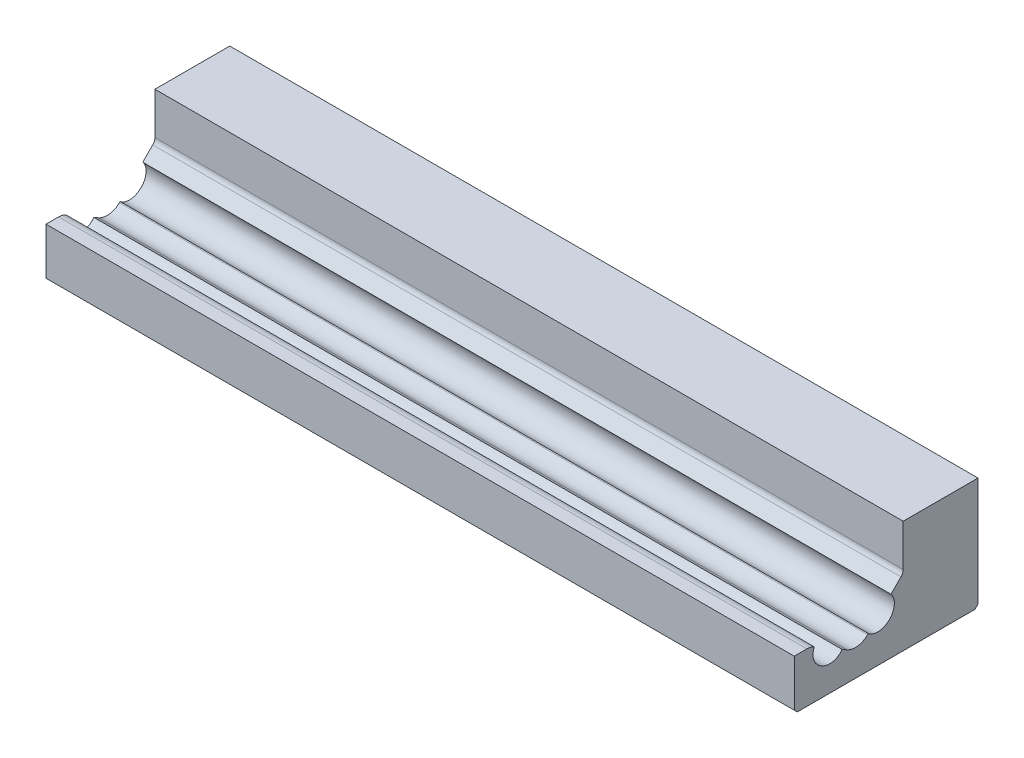
ISO-10303-21;
HEADER;
FILE_DESCRIPTION(('STEP AP214'),'2;1');
FILE_NAME('part.step','',(''),(''),'','','');
FILE_SCHEMA(('AUTOMOTIVE_DESIGN { 1 0 10303 214 1 1 1 1 }'));
ENDSEC;
DATA;
#1=APPLICATION_CONTEXT('core data for automotive mechanical design processes');
#2=APPLICATION_PROTOCOL_DEFINITION('international standard','automotive_design',2000,#1);
#3=PRODUCT_CONTEXT('',#1,'mechanical');
#4=PRODUCT('Part','Part','',(#3));
#5=PRODUCT_RELATED_PRODUCT_CATEGORY('part','',(#4));
#6=PRODUCT_DEFINITION_FORMATION('','',#4);
#7=PRODUCT_DEFINITION_CONTEXT('part definition',#1,'design');
#8=PRODUCT_DEFINITION('design','',#6,#7);
#9=PRODUCT_DEFINITION_SHAPE('','',#8);
#10=(LENGTH_UNIT() NAMED_UNIT(*) SI_UNIT(.MILLI.,.METRE.));
#11=(NAMED_UNIT(*) PLANE_ANGLE_UNIT() SI_UNIT($,.RADIAN.));
#12=(NAMED_UNIT(*) SI_UNIT($,.STERADIAN.) SOLID_ANGLE_UNIT());
#13=UNCERTAINTY_MEASURE_WITH_UNIT(LENGTH_MEASURE(1.E-05),#10,'distance_accuracy_value','');
#14=(GEOMETRIC_REPRESENTATION_CONTEXT(3) GLOBAL_UNCERTAINTY_ASSIGNED_CONTEXT((#13)) GLOBAL_UNIT_ASSIGNED_CONTEXT((#10,
#11,#12)) REPRESENTATION_CONTEXT('',''));
#15=CARTESIAN_POINT('',(0.,0.,0.));
#16=DIRECTION('',(0.,0.,1.));
#17=DIRECTION('',(1.,0.,0.));
#18=AXIS2_PLACEMENT_3D('',#15,#16,#17);
#19=CARTESIAN_POINT('',(100.,1.99999999999996,1.99999999999995));
#20=DIRECTION('',(0.,0.70710678118655,0.707106781186545));
#21=DIRECTION('',(0.,-0.707106781186545,0.70710678118655));
#22=AXIS2_PLACEMENT_3D('',#19,#20,#21);
#23=PLANE('',#22);
#24=DIRECTION('',(0.,0.707106781186545,-0.70710678118655));
#25=VECTOR('',#24,1.);
#26=CARTESIAN_POINT('',(0.,1.99999999999996,1.99999999999995));
#27=LINE('',#26,#25);
#28=CARTESIAN_POINT('',(0.,-10.7520611318491,14.7520611318491));
#29=VERTEX_POINT('',#28);
#30=CARTESIAN_POINT('',(0.,-10.662444372845,14.6624443728451));
#31=VERTEX_POINT('',#30);
#32=EDGE_CURVE('E183',#29,#31,#27,.T.);
#33=ORIENTED_EDGE('',*,*,#32,.F.);
#34=DIRECTION('',(-1.,0.,0.));
#35=VECTOR('',#34,1.);
#36=CARTESIAN_POINT('',(100.,-10.7520611318491,14.7520611318491));
#37=LINE('',#36,#35);
#38=CARTESIAN_POINT('',(100.,-10.7520611318491,14.7520611318491));
#39=VERTEX_POINT('',#38);
#40=EDGE_CURVE('E11',#39,#29,#37,.T.);
#41=ORIENTED_EDGE('',*,*,#40,.F.);
#42=DIRECTION('',(0.,0.707106781186545,-0.70710678118655));
#43=VECTOR('',#42,1.);
#44=CARTESIAN_POINT('',(100.,1.99999999999996,1.99999999999995));
#45=LINE('',#44,#43);
#46=CARTESIAN_POINT('',(100.,-10.662444372845,14.6624443728451));
#47=VERTEX_POINT('',#46);
#48=EDGE_CURVE('E343',#39,#47,#45,.T.);
#49=ORIENTED_EDGE('',*,*,#48,.T.);
#50=DIRECTION('',(-1.,0.,0.));
#51=VECTOR('',#50,1.);
#52=CARTESIAN_POINT('',(100.,-10.662444372845,14.6624443728451));
#53=LINE('',#52,#51);
#54=EDGE_CURVE('E57',#47,#31,#53,.T.);
#55=ORIENTED_EDGE('',*,*,#54,.T.);
#56=EDGE_LOOP('',(#33,#41,#49,#55));
#57=FACE_BOUND('',#56,.T.);
#58=ADVANCED_FACE('F41',(#57),#23,.T.);
#59=CARTESIAN_POINT('',(100.,-9.12571553511999,16.3784067285781));
#60=DIRECTION('',(-1.,0.,0.));
#61=DIRECTION('',(0.,0.,1.));
#62=AXIS2_PLACEMENT_3D('',#59,#60,#61);
#63=CYLINDRICAL_SURFACE('',#62,2.29999999999999);
#64=CARTESIAN_POINT('',(0.,-9.12571553511999,16.3784067285781));
#65=DIRECTION('',(1.,0.,0.));
#66=DIRECTION('',(0.,0.,-1.));
#67=AXIS2_PLACEMENT_3D('',#64,#65,#66);
#68=CIRCLE('',#67,2.29999999999999);
#69=CARTESIAN_POINT('',(0.,-11.117573963824,17.5284067285782));
#70=VERTEX_POINT('',#69);
#71=EDGE_CURVE('E307',#70,#29,#68,.T.);
#72=ORIENTED_EDGE('',*,*,#71,.F.);
#73=DIRECTION('',(-1.,0.,0.));
#74=VECTOR('',#73,1.);
#75=CARTESIAN_POINT('',(100.,-11.117573963824,17.5284067285782));
#76=LINE('',#75,#74);
#77=CARTESIAN_POINT('',(100.,-11.117573963824,17.5284067285782));
#78=VERTEX_POINT('',#77);
#79=EDGE_CURVE('E49',#78,#70,#76,.T.);
#80=ORIENTED_EDGE('',*,*,#79,.F.);
#81=CARTESIAN_POINT('',(100.,-9.12571553511999,16.3784067285781));
#82=DIRECTION('',(1.,0.,0.));
#83=DIRECTION('',(0.,0.,-1.));
#84=AXIS2_PLACEMENT_3D('',#81,#82,#83);
#85=CIRCLE('',#84,2.29999999999999);
#86=EDGE_CURVE('E344',#78,#39,#85,.T.);
#87=ORIENTED_EDGE('',*,*,#86,.T.);
#88=ORIENTED_EDGE('',*,*,#40,.T.);
#89=EDGE_LOOP('',(#72,#80,#87,#88));
#90=FACE_BOUND('',#89,.T.);
#91=ADVANCED_FACE('F312',(#90),#63,.F.);
#92=CARTESIAN_POINT('',(100.,-15.9282032302754,9.19615242270787));
#93=DIRECTION('',(0.,-0.866025403784408,0.500000000000054));
#94=DIRECTION('',(0.,-0.500000000000054,-0.866025403784408));
#95=AXIS2_PLACEMENT_3D('',#92,#93,#94);
#96=PLANE('',#95);
#97=DIRECTION('',(0.,0.500000000000054,0.866025403784408));
#98=VECTOR('',#97,1.);
#99=CARTESIAN_POINT('',(0.,-15.9282032302754,9.19615242270787));
#100=LINE('',#99,#98);
#101=CARTESIAN_POINT('',(0.,-10.7525450203595,18.1606554048919));
#102=VERTEX_POINT('',#101);
#103=EDGE_CURVE('E299',#70,#102,#100,.T.);
#104=ORIENTED_EDGE('',*,*,#103,.T.);
#105=DIRECTION('',(-1.,0.,0.));
#106=VECTOR('',#105,1.);
#107=CARTESIAN_POINT('',(100.,-10.7525450203595,18.1606554048919));
#108=LINE('',#107,#106);
#109=CARTESIAN_POINT('',(100.,-10.7525450203595,18.1606554048919));
#110=VERTEX_POINT('',#109);
#111=EDGE_CURVE('E292',#110,#102,#108,.T.);
#112=ORIENTED_EDGE('',*,*,#111,.F.);
#113=DIRECTION('',(0.,0.500000000000054,0.866025403784408));
#114=VECTOR('',#113,1.);
#115=CARTESIAN_POINT('',(100.,-15.9282032302754,9.19615242270787));
#116=LINE('',#115,#114);
#117=EDGE_CURVE('E243',#78,#110,#116,.T.);
#118=ORIENTED_EDGE('',*,*,#117,.F.);
#119=ORIENTED_EDGE('',*,*,#79,.T.);
#120=EDGE_LOOP('',(#104,#112,#118,#119));
#121=FACE_BOUND('',#120,.T.);
#122=ADVANCED_FACE('F236',(#121),#96,.F.);
#123=CARTESIAN_POINT('',(100.,-9.55066891100103,19.9423658907042));
#124=DIRECTION('',(1.,0.,0.));
#125=DIRECTION('',(0.,-0.500000000000003,-0.866025403784437));
#126=AXIS2_PLACEMENT_3D('',#123,#124,#125);
#127=ELLIPSE('',#126,2.15,2.);
#128=DIRECTION('',(-1.,0.,0.));
#129=VECTOR('',#128,1.);
#130=SURFACE_OF_LINEAR_EXTRUSION('',#127,#129);
#131=ORIENTED_EDGE('',*,*,#111,.T.);
#132=CARTESIAN_POINT('',(0.,-9.55066891100103,19.9423658907042));
#133=DIRECTION('',(1.,0.,0.));
#134=DIRECTION('',(0.,-0.500000000000003,-0.866025403784437));
#135=AXIS2_PLACEMENT_3D('',#132,#133,#134);
#136=ELLIPSE('',#135,2.15,2.);
#137=CARTESIAN_POINT('',(0.,-8.60860042277792,21.8740763765164));
#138=VERTEX_POINT('',#137);
#139=EDGE_CURVE('E310',#138,#102,#136,.T.);
#140=ORIENTED_EDGE('',*,*,#139,.F.);
#141=DIRECTION('',(-1.,0.,0.));
#142=VECTOR('',#141,1.);
#143=CARTESIAN_POINT('',(100.,-8.60860042277792,21.8740763765164));
#144=LINE('',#143,#142);
#145=CARTESIAN_POINT('',(100.,-8.60860042277792,21.8740763765164));
#146=VERTEX_POINT('',#145);
#147=EDGE_CURVE('E290',#146,#138,#144,.T.);
#148=ORIENTED_EDGE('',*,*,#147,.F.);
#149=EDGE_CURVE('E238',#146,#110,#127,.T.);
#150=ORIENTED_EDGE('',*,*,#149,.T.);
#151=EDGE_LOOP('',(#131,#140,#148,#150));
#152=FACE_BOUND('',#151,.T.);
#153=ADVANCED_FACE('F231',(#152),#130,.T.);
#154=CARTESIAN_POINT('',(100.,-10.3406512303467,22.8740763765164));
#155=DIRECTION('',(-1.,0.,0.));
#156=DIRECTION('',(0.,0.,1.));
#157=AXIS2_PLACEMENT_3D('',#154,#155,#156);
#158=CYLINDRICAL_SURFACE('',#157,1.99999999999988);
#159=CARTESIAN_POINT('',(0.,-10.3406512303467,22.8740763765164));
#160=DIRECTION('',(1.,0.,0.));
#161=DIRECTION('',(0.,0.,-1.));
#162=AXIS2_PLACEMENT_3D('',#159,#160,#161);
#163=CIRCLE('',#162,1.99999999999988);
#164=CARTESIAN_POINT('',(0.,-8.34065123034669,22.8740763765164));
#165=VERTEX_POINT('',#164);
#166=EDGE_CURVE('E315',#138,#165,#163,.T.);
#167=ORIENTED_EDGE('',*,*,#166,.T.);
#168=DIRECTION('',(-1.,0.,0.));
#169=VECTOR('',#168,1.);
#170=CARTESIAN_POINT('',(100.,-8.34065123034669,22.8740763765164));
#171=LINE('',#170,#169);
#172=CARTESIAN_POINT('',(100.,-8.34065123034669,22.8740763765164));
#173=VERTEX_POINT('',#172);
#174=EDGE_CURVE('E287',#173,#165,#171,.T.);
#175=ORIENTED_EDGE('',*,*,#174,.F.);
#176=CARTESIAN_POINT('',(100.,-10.3406512303467,22.8740763765164));
#177=DIRECTION('',(1.,0.,0.));
#178=DIRECTION('',(0.,0.,-1.));
#179=AXIS2_PLACEMENT_3D('',#176,#177,#178);
#180=CIRCLE('',#179,1.99999999999988);
#181=EDGE_CURVE('E242',#146,#173,#180,.T.);
#182=ORIENTED_EDGE('',*,*,#181,.F.);
#183=ORIENTED_EDGE('',*,*,#147,.T.);
#184=EDGE_LOOP('',(#167,#175,#182,#183));
#185=FACE_BOUND('',#184,.T.);
#186=ADVANCED_FACE('F227',(#185),#158,.T.);
#187=CARTESIAN_POINT('',(100.,-8.34065123034673,0.));
#188=DIRECTION('',(0.,-1.,0.));
#189=DIRECTION('',(0.,0.,-1.));
#190=AXIS2_PLACEMENT_3D('',#187,#188,#189);
#191=PLANE('',#190);
#192=DIRECTION('',(0.,0.,1.));
#193=VECTOR('',#192,1.);
#194=CARTESIAN_POINT('',(0.,-8.34065123034673,0.));
#195=LINE('',#194,#193);
#196=CARTESIAN_POINT('',(0.,-8.34065123034669,24.5558641755391));
#197=VERTEX_POINT('',#196);
#198=EDGE_CURVE('E317',#165,#197,#195,.T.);
#199=ORIENTED_EDGE('',*,*,#198,.T.);
#200=DIRECTION('',(-1.,0.,0.));
#201=VECTOR('',#200,1.);
#202=CARTESIAN_POINT('',(100.,-8.34065123034669,24.5558641755391));
#203=LINE('',#202,#201);
#204=CARTESIAN_POINT('',(100.,-8.34065123034669,24.5558641755391));
#205=VERTEX_POINT('',#204);
#206=EDGE_CURVE('E285',#205,#197,#203,.T.);
#207=ORIENTED_EDGE('',*,*,#206,.F.);
#208=DIRECTION('',(0.,0.,1.));
#209=VECTOR('',#208,1.);
#210=CARTESIAN_POINT('',(100.,-8.34065123034673,0.));
#211=LINE('',#210,#209);
#212=EDGE_CURVE('E246',#173,#205,#211,.T.);
#213=ORIENTED_EDGE('',*,*,#212,.F.);
#214=ORIENTED_EDGE('',*,*,#174,.T.);
#215=EDGE_LOOP('',(#199,#207,#213,#214));
#216=FACE_BOUND('',#215,.T.);
#217=ADVANCED_FACE('F223',(#216),#191,.F.);
#218=CARTESIAN_POINT('',(100.,0.,24.5558641755391));
#219=DIRECTION('',(0.,0.,1.));
#220=DIRECTION('',(1.,0.,0.));
#221=AXIS2_PLACEMENT_3D('',#218,#219,#220);
#222=PLANE('',#221);
#223=DIRECTION('',(0.,1.,0.));
#224=VECTOR('',#223,1.);
#225=CARTESIAN_POINT('',(0.,0.,24.5558641755391));
#226=LINE('',#225,#224);
#227=CARTESIAN_POINT('',(0.,-14.6,24.5558641755391));
#228=VERTEX_POINT('',#227);
#229=EDGE_CURVE('E320',#228,#197,#226,.T.);
#230=ORIENTED_EDGE('',*,*,#229,.F.);
#231=DIRECTION('',(-1.,0.,0.));
#232=VECTOR('',#231,1.);
#233=CARTESIAN_POINT('',(100.,-14.6,24.5558641755391));
#234=LINE('',#233,#232);
#235=CARTESIAN_POINT('',(100.,-14.6,24.5558641755391));
#236=VERTEX_POINT('',#235);
#237=EDGE_CURVE('E283',#236,#228,#234,.T.);
#238=ORIENTED_EDGE('',*,*,#237,.F.);
#239=DIRECTION('',(0.,1.,0.));
#240=VECTOR('',#239,1.);
#241=CARTESIAN_POINT('',(100.,0.,24.5558641755391));
#242=LINE('',#241,#240);
#243=EDGE_CURVE('E248',#236,#205,#242,.T.);
#244=ORIENTED_EDGE('',*,*,#243,.T.);
#245=ORIENTED_EDGE('',*,*,#206,.T.);
#246=EDGE_LOOP('',(#230,#238,#244,#245));
#247=FACE_BOUND('',#246,.T.);
#248=ADVANCED_FACE('F219',(#247),#222,.T.);
#249=CARTESIAN_POINT('',(100.,-19.5779320877695,19.5779320877695));
#250=DIRECTION('',(0.,0.707106781186548,-0.707106781186548));
#251=DIRECTION('',(0.,0.707106781186548,0.707106781186548));
#252=AXIS2_PLACEMENT_3D('',#249,#250,#251);
#253=PLANE('',#252);
#254=DIRECTION('',(0.,-0.707106781186548,-0.707106781186548));
#255=VECTOR('',#254,1.);
#256=CARTESIAN_POINT('',(0.,-19.5779320877695,19.5779320877695));
#257=LINE('',#256,#255);
#258=CARTESIAN_POINT('',(0.,-15.,24.1558641755391));
#259=VERTEX_POINT('',#258);
#260=EDGE_CURVE('E323',#228,#259,#257,.T.);
#261=ORIENTED_EDGE('',*,*,#260,.T.);
#262=DIRECTION('',(-1.,0.,0.));
#263=VECTOR('',#262,1.);
#264=CARTESIAN_POINT('',(100.,-15.,24.1558641755391));
#265=LINE('',#264,#263);
#266=CARTESIAN_POINT('',(100.,-15.,24.1558641755391));
#267=VERTEX_POINT('',#266);
#268=EDGE_CURVE('E281',#267,#259,#265,.T.);
#269=ORIENTED_EDGE('',*,*,#268,.F.);
#270=DIRECTION('',(0.,-0.707106781186548,-0.707106781186548));
#271=VECTOR('',#270,1.);
#272=CARTESIAN_POINT('',(100.,-19.5779320877695,19.5779320877695));
#273=LINE('',#272,#271);
#274=EDGE_CURVE('E251',#236,#267,#273,.T.);
#275=ORIENTED_EDGE('',*,*,#274,.F.);
#276=ORIENTED_EDGE('',*,*,#237,.T.);
#277=EDGE_LOOP('',(#261,#269,#275,#276));
#278=FACE_BOUND('',#277,.T.);
#279=ADVANCED_FACE('F215',(#278),#253,.F.);
#280=CARTESIAN_POINT('',(100.,-15.,0.));
#281=DIRECTION('',(0.,-1.,0.));
#282=DIRECTION('',(0.,0.,-1.));
#283=AXIS2_PLACEMENT_3D('',#280,#281,#282);
#284=PLANE('',#283);
#285=DIRECTION('',(0.,0.,1.));
#286=VECTOR('',#285,1.);
#287=CARTESIAN_POINT('',(0.,-15.,0.));
#288=LINE('',#287,#286);
#289=CARTESIAN_POINT('',(0.,-15.,0.399999999999998));
#290=VERTEX_POINT('',#289);
#291=EDGE_CURVE('E326',#290,#259,#288,.T.);
#292=ORIENTED_EDGE('',*,*,#291,.F.);
#293=DIRECTION('',(-1.,0.,0.));
#294=VECTOR('',#293,1.);
#295=CARTESIAN_POINT('',(100.,-15.,0.399999999999998));
#296=LINE('',#295,#294);
#297=CARTESIAN_POINT('',(100.,-15.,0.399999999999998));
#298=VERTEX_POINT('',#297);
#299=EDGE_CURVE('E279',#298,#290,#296,.T.);
#300=ORIENTED_EDGE('',*,*,#299,.F.);
#301=DIRECTION('',(0.,0.,1.));
#302=VECTOR('',#301,1.);
#303=CARTESIAN_POINT('',(100.,-15.,0.));
#304=LINE('',#303,#302);
#305=EDGE_CURVE('E253',#298,#267,#304,.T.);
#306=ORIENTED_EDGE('',*,*,#305,.T.);
#307=ORIENTED_EDGE('',*,*,#268,.T.);
#308=EDGE_LOOP('',(#292,#300,#306,#307));
#309=FACE_BOUND('',#308,.T.);
#310=ADVANCED_FACE('F211',(#309),#284,.T.);
#311=CARTESIAN_POINT('',(100.,-7.30000000000008,-7.3));
#312=DIRECTION('',(0.,0.707106781186551,0.707106781186544));
#313=DIRECTION('',(0.,-0.707106781186544,0.707106781186551));
#314=AXIS2_PLACEMENT_3D('',#311,#312,#313);
#315=PLANE('',#314);
#316=DIRECTION('',(0.,0.707106781186544,-0.707106781186551));
#317=VECTOR('',#316,1.);
#318=CARTESIAN_POINT('',(0.,-7.30000000000008,-7.3));
#319=LINE('',#318,#317);
#320=CARTESIAN_POINT('',(0.,-14.6,0.));
#321=VERTEX_POINT('',#320);
#322=EDGE_CURVE('E329',#290,#321,#319,.T.);
#323=ORIENTED_EDGE('',*,*,#322,.T.);
#324=DIRECTION('',(-1.,0.,0.));
#325=VECTOR('',#324,1.);
#326=CARTESIAN_POINT('',(100.,-14.6,0.));
#327=LINE('',#326,#325);
#328=CARTESIAN_POINT('',(100.,-14.6,0.));
#329=VERTEX_POINT('',#328);
#330=EDGE_CURVE('E277',#329,#321,#327,.T.);
#331=ORIENTED_EDGE('',*,*,#330,.F.);
#332=DIRECTION('',(0.,0.707106781186544,-0.707106781186551));
#333=VECTOR('',#332,1.);
#334=CARTESIAN_POINT('',(100.,-7.30000000000008,-7.3));
#335=LINE('',#334,#333);
#336=EDGE_CURVE('E256',#298,#329,#335,.T.);
#337=ORIENTED_EDGE('',*,*,#336,.F.);
#338=ORIENTED_EDGE('',*,*,#299,.T.);
#339=EDGE_LOOP('',(#323,#331,#337,#338));
#340=FACE_BOUND('',#339,.T.);
#341=ADVANCED_FACE('F207',(#340),#315,.F.);
#342=CARTESIAN_POINT('',(100.,0.,0.));
#343=DIRECTION('',(0.,0.,-1.));
#344=DIRECTION('',(-1.,0.,0.));
#345=AXIS2_PLACEMENT_3D('',#342,#343,#344);
#346=PLANE('',#345);
#347=DIRECTION('',(0.,-1.,0.));
#348=VECTOR('',#347,1.);
#349=CARTESIAN_POINT('',(0.,0.,0.));
#350=LINE('',#349,#348);
#351=CARTESIAN_POINT('',(0.,0.,0.));
#352=VERTEX_POINT('',#351);
#353=EDGE_CURVE('E332',#352,#321,#350,.T.);
#354=ORIENTED_EDGE('',*,*,#353,.F.);
#355=DIRECTION('',(-1.,0.,0.));
#356=VECTOR('',#355,1.);
#357=CARTESIAN_POINT('',(100.,0.,0.));
#358=LINE('',#357,#356);
#359=CARTESIAN_POINT('',(100.,0.,0.));
#360=VERTEX_POINT('',#359);
#361=EDGE_CURVE('E270',#360,#352,#358,.T.);
#362=ORIENTED_EDGE('',*,*,#361,.F.);
#363=DIRECTION('',(0.,-1.,0.));
#364=VECTOR('',#363,1.);
#365=CARTESIAN_POINT('',(100.,0.,0.));
#366=LINE('',#365,#364);
#367=EDGE_CURVE('E258',#360,#329,#366,.T.);
#368=ORIENTED_EDGE('',*,*,#367,.T.);
#369=ORIENTED_EDGE('',*,*,#330,.T.);
#370=EDGE_LOOP('',(#354,#362,#368,#369));
#371=FACE_BOUND('',#370,.T.);
#372=ADVANCED_FACE('F203',(#371),#346,.T.);
#373=CARTESIAN_POINT('',(100.,0.,0.));
#374=DIRECTION('',(0.,-1.,0.));
#375=DIRECTION('',(0.,0.,-1.));
#376=AXIS2_PLACEMENT_3D('',#373,#374,#375);
#377=PLANE('',#376);
#378=DIRECTION('',(0.,0.,1.));
#379=VECTOR('',#378,1.);
#380=CARTESIAN_POINT('',(0.,0.,0.));
#381=LINE('',#380,#379);
#382=CARTESIAN_POINT('',(0.,0.,10.));
#383=VERTEX_POINT('',#382);
#384=EDGE_CURVE('E268',#352,#383,#381,.T.);
#385=ORIENTED_EDGE('',*,*,#384,.T.);
#386=DIRECTION('',(-1.,0.,0.));
#387=VECTOR('',#386,1.);
#388=CARTESIAN_POINT('',(100.,0.,10.));
#389=LINE('',#388,#387);
#390=CARTESIAN_POINT('',(100.,0.,10.));
#391=VERTEX_POINT('',#390);
#392=EDGE_CURVE('E266',#391,#383,#389,.T.);
#393=ORIENTED_EDGE('',*,*,#392,.F.);
#394=DIRECTION('',(0.,0.,1.));
#395=VECTOR('',#394,1.);
#396=CARTESIAN_POINT('',(100.,0.,0.));
#397=LINE('',#396,#395);
#398=EDGE_CURVE('E261',#360,#391,#397,.T.);
#399=ORIENTED_EDGE('',*,*,#398,.F.);
#400=ORIENTED_EDGE('',*,*,#361,.T.);
#401=EDGE_LOOP('',(#385,#393,#399,#400));
#402=FACE_BOUND('',#401,.T.);
#403=ADVANCED_FACE('F199',(#402),#377,.F.);
#404=CARTESIAN_POINT('',(100.,0.,10.));
#405=DIRECTION('',(0.,0.,-1.));
#406=DIRECTION('',(-1.,0.,0.));
#407=AXIS2_PLACEMENT_3D('',#404,#405,#406);
#408=PLANE('',#407);
#409=DIRECTION('',(0.,-1.,0.));
#410=VECTOR('',#409,1.);
#411=CARTESIAN_POINT('',(0.,0.,10.));
#412=LINE('',#411,#410);
#413=CARTESIAN_POINT('',(0.,-5.5857864376269,10.));
#414=VERTEX_POINT('',#413);
#415=EDGE_CURVE('E272',#383,#414,#412,.T.);
#416=ORIENTED_EDGE('',*,*,#415,.T.);
#417=DIRECTION('',(-1.,0.,0.));
#418=VECTOR('',#417,1.);
#419=CARTESIAN_POINT('',(100.,-5.5857864376269,10.));
#420=LINE('',#419,#418);
#421=CARTESIAN_POINT('',(100.,-5.5857864376269,10.));
#422=VERTEX_POINT('',#421);
#423=EDGE_CURVE('E174',#422,#414,#420,.T.);
#424=ORIENTED_EDGE('',*,*,#423,.F.);
#425=DIRECTION('',(0.,-1.,0.));
#426=VECTOR('',#425,1.);
#427=CARTESIAN_POINT('',(100.,0.,10.));
#428=LINE('',#427,#426);
#429=EDGE_CURVE('E162',#391,#422,#428,.T.);
#430=ORIENTED_EDGE('',*,*,#429,.F.);
#431=ORIENTED_EDGE('',*,*,#392,.T.);
#432=EDGE_LOOP('',(#416,#424,#430,#431));
#433=FACE_BOUND('',#432,.T.);
#434=ADVANCED_FACE('F196',(#433),#408,.F.);
#435=CARTESIAN_POINT('',(100.,-5.58578643762691,11.));
#436=DIRECTION('',(-1.,0.,0.));
#437=DIRECTION('',(0.,0.,1.));
#438=AXIS2_PLACEMENT_3D('',#435,#436,#437);
#439=CYLINDRICAL_SURFACE('',#438,0.999999999999999);
#440=CARTESIAN_POINT('',(0.,-5.58578643762691,11.));
#441=DIRECTION('',(1.,0.,0.));
#442=DIRECTION('',(0.,0.,-1.));
#443=AXIS2_PLACEMENT_3D('',#440,#441,#442);
#444=CIRCLE('',#443,0.999999999999999);
#445=CARTESIAN_POINT('',(0.,-6.29289321881346,10.2928932188135));
#446=VERTEX_POINT('',#445);
#447=EDGE_CURVE('E171',#414,#446,#444,.F.);
#448=ORIENTED_EDGE('',*,*,#447,.T.);
#449=DIRECTION('',(-1.,0.,0.));
#450=VECTOR('',#449,1.);
#451=CARTESIAN_POINT('',(100.,-6.29289321881346,10.2928932188135));
#452=LINE('',#451,#450);
#453=CARTESIAN_POINT('',(100.,-6.29289321881346,10.2928932188135));
#454=VERTEX_POINT('',#453);
#455=EDGE_CURVE('E168',#454,#446,#452,.T.);
#456=ORIENTED_EDGE('',*,*,#455,.F.);
#457=CARTESIAN_POINT('',(100.,-5.58578643762691,11.));
#458=DIRECTION('',(1.,0.,0.));
#459=DIRECTION('',(0.,0.,-1.));
#460=AXIS2_PLACEMENT_3D('',#457,#458,#459);
#461=CIRCLE('',#460,0.999999999999999);
#462=EDGE_CURVE('E155',#422,#454,#461,.F.);
#463=ORIENTED_EDGE('',*,*,#462,.F.);
#464=ORIENTED_EDGE('',*,*,#423,.T.);
#465=EDGE_LOOP('',(#448,#456,#463,#464));
#466=FACE_BOUND('',#465,.T.);
#467=ADVANCED_FACE('F169',(#466),#439,.F.);
#468=CARTESIAN_POINT('',(100.,2.,2.));
#469=DIRECTION('',(0.,-0.707106781186548,-0.707106781186547));
#470=DIRECTION('',(0.,0.707106781186547,-0.707106781186548));
#471=AXIS2_PLACEMENT_3D('',#468,#469,#470);
#472=PLANE('',#471);
#473=DIRECTION('',(0.,-0.707106781186547,0.707106781186548));
#474=VECTOR('',#473,1.);
#475=CARTESIAN_POINT('',(0.,2.,2.));
#476=LINE('',#475,#474);
#477=CARTESIAN_POINT('',(0.,-7.6304488459684,11.6304488459684));
#478=VERTEX_POINT('',#477);
#479=EDGE_CURVE('E338',#446,#478,#476,.T.);
#480=ORIENTED_EDGE('',*,*,#479,.T.);
#481=DIRECTION('',(-1.,0.,0.));
#482=VECTOR('',#481,1.);
#483=CARTESIAN_POINT('',(100.,-7.6304488459684,11.6304488459684));
#484=LINE('',#483,#482);
#485=CARTESIAN_POINT('',(100.,-7.6304488459684,11.6304488459684));
#486=VERTEX_POINT('',#485);
#487=EDGE_CURVE('E107',#486,#478,#484,.T.);
#488=ORIENTED_EDGE('',*,*,#487,.F.);
#489=DIRECTION('',(0.,-0.707106781186547,0.707106781186548));
#490=VECTOR('',#489,1.);
#491=CARTESIAN_POINT('',(100.,2.,2.));
#492=LINE('',#491,#490);
#493=EDGE_CURVE('E160',#454,#486,#492,.T.);
#494=ORIENTED_EDGE('',*,*,#493,.F.);
#495=ORIENTED_EDGE('',*,*,#455,.T.);
#496=EDGE_LOOP('',(#480,#488,#494,#495));
#497=FACE_BOUND('',#496,.T.);
#498=ADVANCED_FACE('F176',(#497),#472,.F.);
#499=CARTESIAN_POINT('',(100.,-9.04038059222874,13.2525126265847));
#500=DIRECTION('',(1.,0.,0.));
#501=DIRECTION('',(0.,-0.707106781186547,0.707106781186548));
#502=AXIS2_PLACEMENT_3D('',#499,#500,#501);
#503=ELLIPSE('',#502,2.15,2.);
#504=DIRECTION('',(-1.,0.,0.));
#505=VECTOR('',#504,1.);
#506=SURFACE_OF_LINEAR_EXTRUSION('',#503,#505);
#507=CARTESIAN_POINT('',(0.,-9.04038059222874,13.2525126265847));
#508=DIRECTION('',(1.,0.,0.));
#509=DIRECTION('',(0.,-0.707106781186547,0.707106781186548));
#510=AXIS2_PLACEMENT_3D('',#507,#508,#509);
#511=ELLIPSE('',#510,2.15,2.);
#512=EDGE_CURVE('E340',#31,#478,#511,.T.);
#513=ORIENTED_EDGE('',*,*,#512,.F.);
#514=ORIENTED_EDGE('',*,*,#54,.F.);
#515=EDGE_CURVE('E177',#47,#486,#503,.T.);
#516=ORIENTED_EDGE('',*,*,#515,.T.);
#517=ORIENTED_EDGE('',*,*,#487,.T.);
#518=EDGE_LOOP('',(#513,#514,#516,#517));
#519=FACE_BOUND('',#518,.T.);
#520=ADVANCED_FACE('F186',(#519),#506,.T.);
#521=CARTESIAN_POINT('',(100.,0.,0.));
#522=DIRECTION('',(1.,0.,0.));
#523=DIRECTION('',(0.,0.,-1.));
#524=AXIS2_PLACEMENT_3D('',#521,#522,#523);
#525=PLANE('',#524);
#526=ORIENTED_EDGE('',*,*,#48,.F.);
#527=ORIENTED_EDGE('',*,*,#86,.F.);
#528=ORIENTED_EDGE('',*,*,#117,.T.);
#529=ORIENTED_EDGE('',*,*,#149,.F.);
#530=ORIENTED_EDGE('',*,*,#181,.T.);
#531=ORIENTED_EDGE('',*,*,#212,.T.);
#532=ORIENTED_EDGE('',*,*,#243,.F.);
#533=ORIENTED_EDGE('',*,*,#274,.T.);
#534=ORIENTED_EDGE('',*,*,#305,.F.);
#535=ORIENTED_EDGE('',*,*,#336,.T.);
#536=ORIENTED_EDGE('',*,*,#367,.F.);
#537=ORIENTED_EDGE('',*,*,#398,.T.);
#538=ORIENTED_EDGE('',*,*,#429,.T.);
#539=ORIENTED_EDGE('',*,*,#462,.T.);
#540=ORIENTED_EDGE('',*,*,#493,.T.);
#541=ORIENTED_EDGE('',*,*,#515,.F.);
#542=EDGE_LOOP('',(#526,#527,#528,#529,#530,#531,#532,#533,#534,#535,#536,#537,#538,#539,#540,#541));
#543=FACE_BOUND('',#542,.T.);
#544=ADVANCED_FACE('F157',(#543),#525,.T.);
#545=CARTESIAN_POINT('',(0.,0.,0.));
#546=DIRECTION('',(1.,0.,0.));
#547=DIRECTION('',(0.,0.,-1.));
#548=AXIS2_PLACEMENT_3D('',#545,#546,#547);
#549=PLANE('',#548);
#550=ORIENTED_EDGE('',*,*,#32,.T.);
#551=ORIENTED_EDGE('',*,*,#512,.T.);
#552=ORIENTED_EDGE('',*,*,#479,.F.);
#553=ORIENTED_EDGE('',*,*,#447,.F.);
#554=ORIENTED_EDGE('',*,*,#415,.F.);
#555=ORIENTED_EDGE('',*,*,#384,.F.);
#556=ORIENTED_EDGE('',*,*,#353,.T.);
#557=ORIENTED_EDGE('',*,*,#322,.F.);
#558=ORIENTED_EDGE('',*,*,#291,.T.);
#559=ORIENTED_EDGE('',*,*,#260,.F.);
#560=ORIENTED_EDGE('',*,*,#229,.T.);
#561=ORIENTED_EDGE('',*,*,#198,.F.);
#562=ORIENTED_EDGE('',*,*,#166,.F.);
#563=ORIENTED_EDGE('',*,*,#139,.T.);
#564=ORIENTED_EDGE('',*,*,#103,.F.);
#565=ORIENTED_EDGE('',*,*,#71,.T.);
#566=EDGE_LOOP('',(#550,#551,#552,#553,#554,#555,#556,#557,#558,#559,#560,#561,#562,#563,#564,#565));
#567=FACE_BOUND('',#566,.T.);
#568=ADVANCED_FACE('F190',(#567),#549,.F.);
#569=CLOSED_SHELL('',(#58,#91,#122,#153,#186,#217,#248,#279,#310,#341,#372,#403,#434,#467,#498,
#520,#544,#568));
#570=MANIFOLD_SOLID_BREP('B2',#569);
#571=ADVANCED_BREP_SHAPE_REPRESENTATION('',(#18,#570),#14);
#572=SHAPE_DEFINITION_REPRESENTATION(#9,#571);
ENDSEC;
END-ISO-10303-21;
